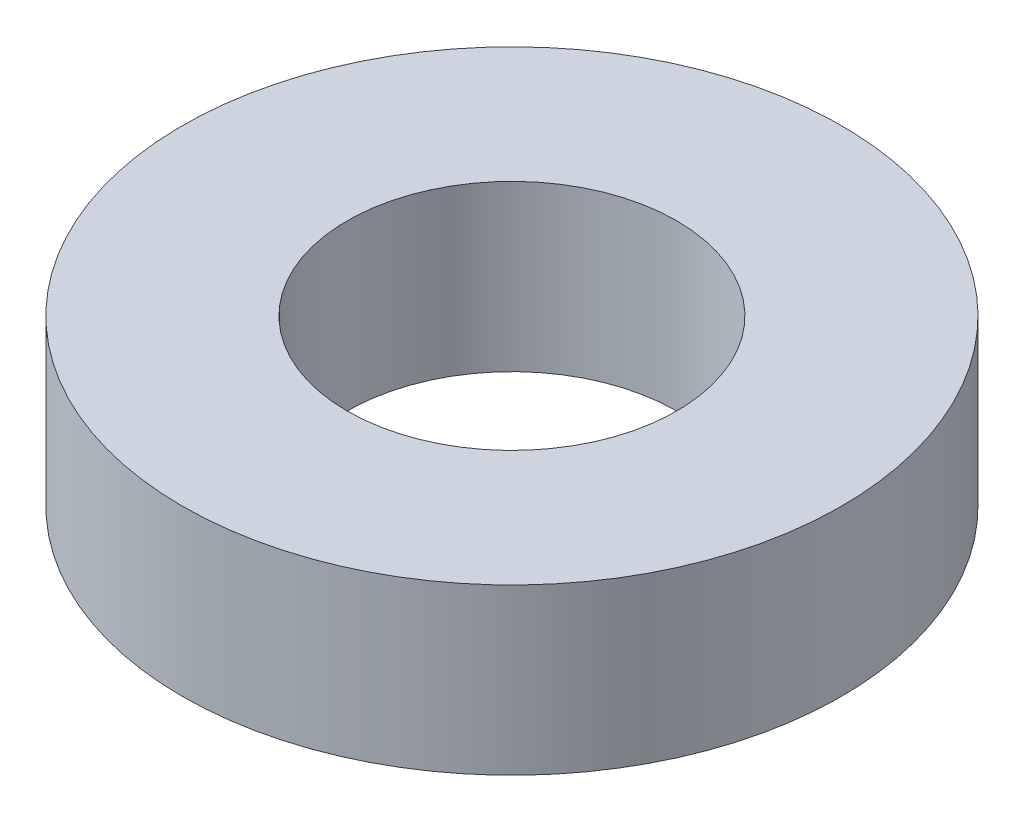
ISO-10303-21;
HEADER;
FILE_DESCRIPTION(('STEP AP214'),'2;1');
FILE_NAME('part.step','',(''),(''),'','','');
FILE_SCHEMA(('AUTOMOTIVE_DESIGN { 1 0 10303 214 1 1 1 1 }'));
ENDSEC;
DATA;
#1=APPLICATION_CONTEXT('core data for automotive mechanical design processes');
#2=APPLICATION_PROTOCOL_DEFINITION('international standard','automotive_design',2000,#1);
#3=PRODUCT_CONTEXT('',#1,'mechanical');
#4=PRODUCT('Part','Part','',(#3));
#5=PRODUCT_RELATED_PRODUCT_CATEGORY('part','',(#4));
#6=PRODUCT_DEFINITION_FORMATION('','',#4);
#7=PRODUCT_DEFINITION_CONTEXT('part definition',#1,'design');
#8=PRODUCT_DEFINITION('design','',#6,#7);
#9=PRODUCT_DEFINITION_SHAPE('','',#8);
#10=(LENGTH_UNIT() NAMED_UNIT(*) SI_UNIT(.MILLI.,.METRE.));
#11=(NAMED_UNIT(*) PLANE_ANGLE_UNIT() SI_UNIT($,.RADIAN.));
#12=(NAMED_UNIT(*) SI_UNIT($,.STERADIAN.) SOLID_ANGLE_UNIT());
#13=UNCERTAINTY_MEASURE_WITH_UNIT(LENGTH_MEASURE(1.E-05),#10,'distance_accuracy_value','');
#14=(GEOMETRIC_REPRESENTATION_CONTEXT(3) GLOBAL_UNCERTAINTY_ASSIGNED_CONTEXT((#13)) GLOBAL_UNIT_ASSIGNED_CONTEXT((#10,
#11,#12)) REPRESENTATION_CONTEXT('',''));
#15=CARTESIAN_POINT('',(0.,0.,0.));
#16=DIRECTION('',(0.,0.,1.));
#17=DIRECTION('',(1.,0.,0.));
#18=AXIS2_PLACEMENT_3D('',#15,#16,#17);
#19=CARTESIAN_POINT('',(0.,1.,0.));
#20=DIRECTION('',(0.,1.,0.));
#21=DIRECTION('',(0.,0.,1.));
#22=AXIS2_PLACEMENT_3D('',#19,#20,#21);
#23=PLANE('',#22);
#24=CARTESIAN_POINT('',(0.,1.,0.));
#25=DIRECTION('',(0.,1.,0.));
#26=DIRECTION('',(0.,0.,1.));
#27=AXIS2_PLACEMENT_3D('',#24,#25,#26);
#28=CIRCLE('',#27,2.);
#29=CARTESIAN_POINT('',(0.,1.,2.));
#30=VERTEX_POINT('',#29);
#31=EDGE_CURVE('E10',#30,#30,#28,.T.);
#32=ORIENTED_EDGE('',*,*,#31,.T.);
#33=EDGE_LOOP('',(#32));
#34=FACE_BOUND('',#33,.T.);
#35=CARTESIAN_POINT('',(0.,1.,0.));
#36=DIRECTION('',(0.,1.,0.));
#37=DIRECTION('',(0.,0.,1.));
#38=AXIS2_PLACEMENT_3D('',#35,#36,#37);
#39=CIRCLE('',#38,1.);
#40=CARTESIAN_POINT('',(0.,1.,1.));
#41=VERTEX_POINT('',#40);
#42=EDGE_CURVE('E41',#41,#41,#39,.T.);
#43=ORIENTED_EDGE('',*,*,#42,.F.);
#44=EDGE_LOOP('',(#43));
#45=FACE_BOUND('',#44,.T.);
#46=ADVANCED_FACE('F30',(#34,#45),#23,.T.);
#47=CARTESIAN_POINT('',(0.,0.,0.));
#48=DIRECTION('',(0.,1.,0.));
#49=DIRECTION('',(0.,0.,1.));
#50=AXIS2_PLACEMENT_3D('',#47,#48,#49);
#51=PLANE('',#50);
#52=CARTESIAN_POINT('',(0.,0.,0.));
#53=DIRECTION('',(0.,1.,0.));
#54=DIRECTION('',(0.,0.,1.));
#55=AXIS2_PLACEMENT_3D('',#52,#53,#54);
#56=CIRCLE('',#55,2.);
#57=CARTESIAN_POINT('',(0.,0.,2.));
#58=VERTEX_POINT('',#57);
#59=EDGE_CURVE('E34',#58,#58,#56,.T.);
#60=ORIENTED_EDGE('',*,*,#59,.F.);
#61=EDGE_LOOP('',(#60));
#62=FACE_BOUND('',#61,.T.);
#63=CARTESIAN_POINT('',(0.,0.,0.));
#64=DIRECTION('',(0.,1.,0.));
#65=DIRECTION('',(0.,0.,1.));
#66=AXIS2_PLACEMENT_3D('',#63,#64,#65);
#67=CIRCLE('',#66,1.);
#68=CARTESIAN_POINT('',(0.,0.,1.));
#69=VERTEX_POINT('',#68);
#70=EDGE_CURVE('E43',#69,#69,#67,.T.);
#71=ORIENTED_EDGE('',*,*,#70,.T.);
#72=EDGE_LOOP('',(#71));
#73=FACE_BOUND('',#72,.T.);
#74=ADVANCED_FACE('F53',(#62,#73),#51,.F.);
#75=CARTESIAN_POINT('',(0.,1.,0.));
#76=DIRECTION('',(0.,-1.,0.));
#77=DIRECTION('',(0.,0.,-1.));
#78=AXIS2_PLACEMENT_3D('',#75,#76,#77);
#79=CYLINDRICAL_SURFACE('',#78,2.);
#80=ORIENTED_EDGE('',*,*,#31,.F.);
#81=EDGE_LOOP('',(#80));
#82=FACE_BOUND('',#81,.T.);
#83=ORIENTED_EDGE('',*,*,#59,.T.);
#84=EDGE_LOOP('',(#83));
#85=FACE_BOUND('',#84,.T.);
#86=ADVANCED_FACE('F32',(#82,#85),#79,.T.);
#87=CARTESIAN_POINT('',(0.,1.,0.));
#88=DIRECTION('',(0.,-1.,0.));
#89=DIRECTION('',(0.,0.,-1.));
#90=AXIS2_PLACEMENT_3D('',#87,#88,#89);
#91=CYLINDRICAL_SURFACE('',#90,1.);
#92=ORIENTED_EDGE('',*,*,#42,.T.);
#93=EDGE_LOOP('',(#92));
#94=FACE_BOUND('',#93,.T.);
#95=ORIENTED_EDGE('',*,*,#70,.F.);
#96=EDGE_LOOP('',(#95));
#97=FACE_BOUND('',#96,.T.);
#98=ADVANCED_FACE('F49',(#94,#97),#91,.F.);
#99=CLOSED_SHELL('',(#46,#74,#86,#98));
#100=MANIFOLD_SOLID_BREP('B2',#99);
#101=ADVANCED_BREP_SHAPE_REPRESENTATION('',(#18,#100),#14);
#102=SHAPE_DEFINITION_REPRESENTATION(#9,#101);
ENDSEC;
END-ISO-10303-21;
